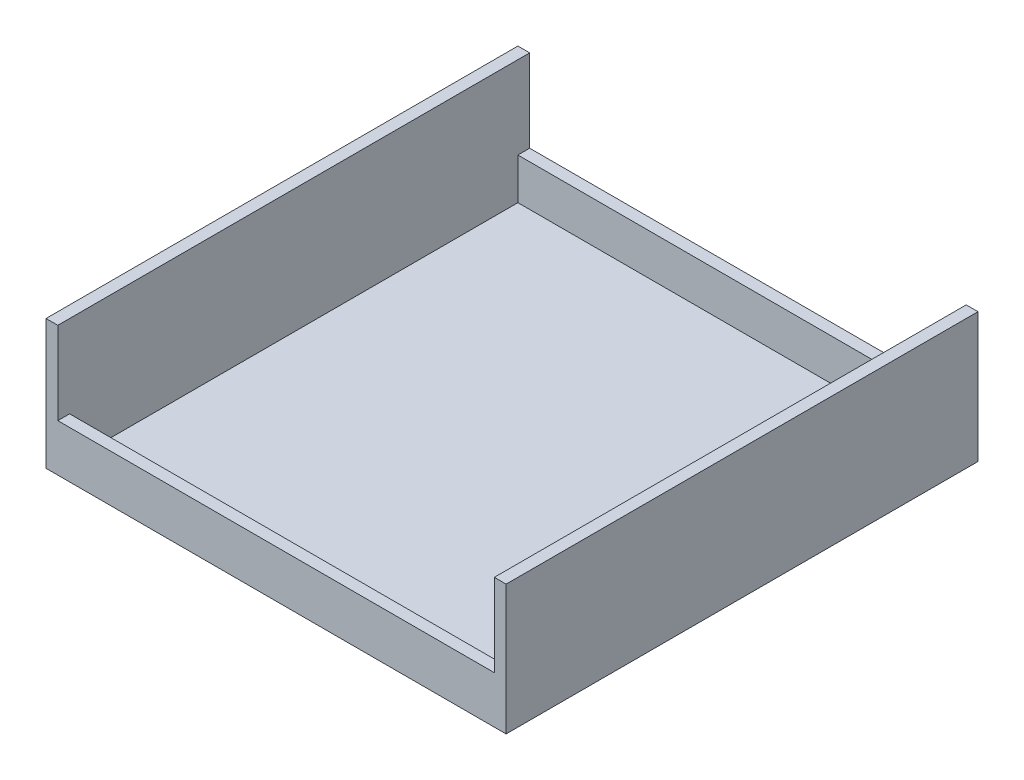
ISO-10303-21;
HEADER;
FILE_DESCRIPTION(('STEP AP214'),'2;1');
FILE_NAME('part.step','',(''),(''),'','','');
FILE_SCHEMA(('AUTOMOTIVE_DESIGN { 1 0 10303 214 1 1 1 1 }'));
ENDSEC;
DATA;
#1=APPLICATION_CONTEXT('core data for automotive mechanical design processes');
#2=APPLICATION_PROTOCOL_DEFINITION('international standard','automotive_design',2000,#1);
#3=PRODUCT_CONTEXT('',#1,'mechanical');
#4=PRODUCT('Part','Part','',(#3));
#5=PRODUCT_RELATED_PRODUCT_CATEGORY('part','',(#4));
#6=PRODUCT_DEFINITION_FORMATION('','',#4);
#7=PRODUCT_DEFINITION_CONTEXT('part definition',#1,'design');
#8=PRODUCT_DEFINITION('design','',#6,#7);
#9=PRODUCT_DEFINITION_SHAPE('','',#8);
#10=(LENGTH_UNIT() NAMED_UNIT(*) SI_UNIT(.MILLI.,.METRE.));
#11=(NAMED_UNIT(*) PLANE_ANGLE_UNIT() SI_UNIT($,.RADIAN.));
#12=(NAMED_UNIT(*) SI_UNIT($,.STERADIAN.) SOLID_ANGLE_UNIT());
#13=UNCERTAINTY_MEASURE_WITH_UNIT(LENGTH_MEASURE(1.E-05),#10,'distance_accuracy_value','');
#14=(GEOMETRIC_REPRESENTATION_CONTEXT(3) GLOBAL_UNCERTAINTY_ASSIGNED_CONTEXT((#13)) GLOBAL_UNIT_ASSIGNED_CONTEXT((#10,
#11,#12)) REPRESENTATION_CONTEXT('',''));
#15=CARTESIAN_POINT('',(0.,0.,0.));
#16=DIRECTION('',(0.,0.,1.));
#17=DIRECTION('',(1.,0.,0.));
#18=AXIS2_PLACEMENT_3D('',#15,#16,#17);
#19=CARTESIAN_POINT('',(0.,1.,0.));
#20=DIRECTION('',(0.,-1.,0.));
#21=DIRECTION('',(0.,0.,-1.));
#22=AXIS2_PLACEMENT_3D('',#19,#20,#21);
#23=PLANE('',#22);
#24=DIRECTION('',(1.,0.,0.));
#25=VECTOR('',#24,1.);
#26=CARTESIAN_POINT('',(76.,1.,-78.));
#27=LINE('',#26,#25);
#28=CARTESIAN_POINT('',(2.,1.,-78.));
#29=VERTEX_POINT('',#28);
#30=CARTESIAN_POINT('',(76.,1.,-78.));
#31=VERTEX_POINT('',#30);
#32=EDGE_CURVE('E61',#29,#31,#27,.T.);
#33=ORIENTED_EDGE('',*,*,#32,.F.);
#34=DIRECTION('',(0.,0.,-1.));
#35=VECTOR('',#34,1.);
#36=CARTESIAN_POINT('',(2.,1.,0.));
#37=LINE('',#36,#35);
#38=CARTESIAN_POINT('',(2.,1.,-2.));
#39=VERTEX_POINT('',#38);
#40=EDGE_CURVE('E39',#39,#29,#37,.T.);
#41=ORIENTED_EDGE('',*,*,#40,.F.);
#42=DIRECTION('',(-1.,0.,0.));
#43=VECTOR('',#42,1.);
#44=CARTESIAN_POINT('',(2.,1.,-2.));
#45=LINE('',#44,#43);
#46=CARTESIAN_POINT('',(76.,1.,-2.));
#47=VERTEX_POINT('',#46);
#48=EDGE_CURVE('E156',#47,#39,#45,.T.);
#49=ORIENTED_EDGE('',*,*,#48,.F.);
#50=DIRECTION('',(0.,0.,1.));
#51=VECTOR('',#50,1.);
#52=CARTESIAN_POINT('',(76.,1.,0.));
#53=LINE('',#52,#51);
#54=EDGE_CURVE('E134',#31,#47,#53,.T.);
#55=ORIENTED_EDGE('',*,*,#54,.F.);
#56=EDGE_LOOP('',(#33,#41,#49,#55));
#57=FACE_BOUND('',#56,.T.);
#58=ADVANCED_FACE('F35',(#57),#23,.F.);
#59=CARTESIAN_POINT('',(2.,22.,0.));
#60=DIRECTION('',(-1.,0.,0.));
#61=DIRECTION('',(0.,0.,1.));
#62=AXIS2_PLACEMENT_3D('',#59,#60,#61);
#63=PLANE('',#62);
#64=DIRECTION('',(0.,-1.,0.));
#65=VECTOR('',#64,1.);
#66=CARTESIAN_POINT('',(2.,8.,-78.));
#67=LINE('',#66,#65);
#68=CARTESIAN_POINT('',(2.,8.,-78.));
#69=VERTEX_POINT('',#68);
#70=EDGE_CURVE('E53',#69,#29,#67,.T.);
#71=ORIENTED_EDGE('',*,*,#70,.F.);
#72=DIRECTION('',(0.,0.,1.));
#73=VECTOR('',#72,1.);
#74=CARTESIAN_POINT('',(2.,8.,-80.));
#75=LINE('',#74,#73);
#76=CARTESIAN_POINT('',(2.,8.,-80.));
#77=VERTEX_POINT('',#76);
#78=EDGE_CURVE('E227',#77,#69,#75,.T.);
#79=ORIENTED_EDGE('',*,*,#78,.F.);
#80=DIRECTION('',(0.,-1.,0.));
#81=VECTOR('',#80,1.);
#82=CARTESIAN_POINT('',(2.,22.,-80.));
#83=LINE('',#82,#81);
#84=CARTESIAN_POINT('',(2.,22.,-80.));
#85=VERTEX_POINT('',#84);
#86=EDGE_CURVE('E183',#85,#77,#83,.T.);
#87=ORIENTED_EDGE('',*,*,#86,.F.);
#88=DIRECTION('',(0.,0.,-1.));
#89=VECTOR('',#88,1.);
#90=CARTESIAN_POINT('',(2.,22.,0.));
#91=LINE('',#90,#89);
#92=CARTESIAN_POINT('',(2.,22.,0.));
#93=VERTEX_POINT('',#92);
#94=EDGE_CURVE('E179',#93,#85,#91,.T.);
#95=ORIENTED_EDGE('',*,*,#94,.F.);
#96=DIRECTION('',(0.,-1.,0.));
#97=VECTOR('',#96,1.);
#98=CARTESIAN_POINT('',(2.,22.,0.));
#99=LINE('',#98,#97);
#100=CARTESIAN_POINT('',(2.,8.,0.));
#101=VERTEX_POINT('',#100);
#102=EDGE_CURVE('E190',#93,#101,#99,.T.);
#103=ORIENTED_EDGE('',*,*,#102,.T.);
#104=DIRECTION('',(0.,0.,1.));
#105=VECTOR('',#104,1.);
#106=CARTESIAN_POINT('',(2.,8.,0.));
#107=LINE('',#106,#105);
#108=CARTESIAN_POINT('',(2.,8.,-2.));
#109=VERTEX_POINT('',#108);
#110=EDGE_CURVE('E157',#109,#101,#107,.T.);
#111=ORIENTED_EDGE('',*,*,#110,.F.);
#112=DIRECTION('',(0.,-1.,0.));
#113=VECTOR('',#112,1.);
#114=CARTESIAN_POINT('',(2.,8.,-2.));
#115=LINE('',#114,#113);
#116=EDGE_CURVE('E139',#109,#39,#115,.T.);
#117=ORIENTED_EDGE('',*,*,#116,.T.);
#118=ORIENTED_EDGE('',*,*,#40,.T.);
#119=EDGE_LOOP('',(#71,#79,#87,#95,#103,#111,#117,#118));
#120=FACE_BOUND('',#119,.T.);
#121=ADVANCED_FACE('F211',(#120),#63,.F.);
#122=CARTESIAN_POINT('',(76.,22.,0.));
#123=DIRECTION('',(1.,0.,0.));
#124=DIRECTION('',(0.,0.,-1.));
#125=AXIS2_PLACEMENT_3D('',#122,#123,#124);
#126=PLANE('',#125);
#127=DIRECTION('',(0.,-1.,0.));
#128=VECTOR('',#127,1.);
#129=CARTESIAN_POINT('',(76.,8.,-78.));
#130=LINE('',#129,#128);
#131=CARTESIAN_POINT('',(76.,8.,-78.));
#132=VERTEX_POINT('',#131);
#133=EDGE_CURVE('E220',#132,#31,#130,.T.);
#134=ORIENTED_EDGE('',*,*,#133,.T.);
#135=ORIENTED_EDGE('',*,*,#54,.T.);
#136=DIRECTION('',(0.,-1.,0.));
#137=VECTOR('',#136,1.);
#138=CARTESIAN_POINT('',(76.,8.,-2.));
#139=LINE('',#138,#137);
#140=CARTESIAN_POINT('',(76.,8.,-2.));
#141=VERTEX_POINT('',#140);
#142=EDGE_CURVE('E128',#141,#47,#139,.T.);
#143=ORIENTED_EDGE('',*,*,#142,.F.);
#144=DIRECTION('',(0.,0.,-1.));
#145=VECTOR('',#144,1.);
#146=CARTESIAN_POINT('',(76.,8.,0.));
#147=LINE('',#146,#145);
#148=CARTESIAN_POINT('',(76.,8.,0.));
#149=VERTEX_POINT('',#148);
#150=EDGE_CURVE('E132',#149,#141,#147,.T.);
#151=ORIENTED_EDGE('',*,*,#150,.F.);
#152=DIRECTION('',(0.,-1.,0.));
#153=VECTOR('',#152,1.);
#154=CARTESIAN_POINT('',(76.,22.,0.));
#155=LINE('',#154,#153);
#156=CARTESIAN_POINT('',(76.,22.,0.));
#157=VERTEX_POINT('',#156);
#158=EDGE_CURVE('E169',#157,#149,#155,.T.);
#159=ORIENTED_EDGE('',*,*,#158,.F.);
#160=DIRECTION('',(0.,0.,1.));
#161=VECTOR('',#160,1.);
#162=CARTESIAN_POINT('',(76.,22.,0.));
#163=LINE('',#162,#161);
#164=CARTESIAN_POINT('',(76.,22.,-80.));
#165=VERTEX_POINT('',#164);
#166=EDGE_CURVE('E164',#165,#157,#163,.T.);
#167=ORIENTED_EDGE('',*,*,#166,.F.);
#168=DIRECTION('',(0.,-1.,0.));
#169=VECTOR('',#168,1.);
#170=CARTESIAN_POINT('',(76.,22.,-80.));
#171=LINE('',#170,#169);
#172=CARTESIAN_POINT('',(76.,8.,-80.));
#173=VERTEX_POINT('',#172);
#174=EDGE_CURVE('E172',#165,#173,#171,.T.);
#175=ORIENTED_EDGE('',*,*,#174,.T.);
#176=DIRECTION('',(0.,0.,-1.));
#177=VECTOR('',#176,1.);
#178=CARTESIAN_POINT('',(76.,8.,-80.));
#179=LINE('',#178,#177);
#180=EDGE_CURVE('E224',#132,#173,#179,.T.);
#181=ORIENTED_EDGE('',*,*,#180,.F.);
#182=EDGE_LOOP('',(#134,#135,#143,#151,#159,#167,#175,#181));
#183=FACE_BOUND('',#182,.T.);
#184=ADVANCED_FACE('F130',(#183),#126,.F.);
#185=CARTESIAN_POINT('',(0.,1.,0.));
#186=DIRECTION('',(1.,0.,0.));
#187=DIRECTION('',(0.,0.,-1.));
#188=AXIS2_PLACEMENT_3D('',#185,#186,#187);
#189=PLANE('',#188);
#190=DIRECTION('',(0.,0.,1.));
#191=VECTOR('',#190,1.);
#192=CARTESIAN_POINT('',(0.,0.,0.));
#193=LINE('',#192,#191);
#194=CARTESIAN_POINT('',(0.,0.,-80.));
#195=VERTEX_POINT('',#194);
#196=CARTESIAN_POINT('',(0.,0.,0.));
#197=VERTEX_POINT('',#196);
#198=EDGE_CURVE('E186',#195,#197,#193,.T.);
#199=ORIENTED_EDGE('',*,*,#198,.T.);
#200=DIRECTION('',(0.,-1.,0.));
#201=VECTOR('',#200,1.);
#202=CARTESIAN_POINT('',(0.,1.,0.));
#203=LINE('',#202,#201);
#204=CARTESIAN_POINT('',(0.,22.,0.));
#205=VERTEX_POINT('',#204);
#206=EDGE_CURVE('E11',#205,#197,#203,.T.);
#207=ORIENTED_EDGE('',*,*,#206,.F.);
#208=DIRECTION('',(0.,0.,1.));
#209=VECTOR('',#208,1.);
#210=CARTESIAN_POINT('',(0.,22.,0.));
#211=LINE('',#210,#209);
#212=CARTESIAN_POINT('',(0.,22.,-80.));
#213=VERTEX_POINT('',#212);
#214=EDGE_CURVE('E174',#213,#205,#211,.T.);
#215=ORIENTED_EDGE('',*,*,#214,.F.);
#216=DIRECTION('',(0.,-1.,0.));
#217=VECTOR('',#216,1.);
#218=CARTESIAN_POINT('',(0.,1.,-80.));
#219=LINE('',#218,#217);
#220=EDGE_CURVE('E196',#213,#195,#219,.T.);
#221=ORIENTED_EDGE('',*,*,#220,.T.);
#222=EDGE_LOOP('',(#199,#207,#215,#221));
#223=FACE_BOUND('',#222,.T.);
#224=ADVANCED_FACE('F37',(#223),#189,.F.);
#225=CARTESIAN_POINT('',(0.,1.,0.));
#226=DIRECTION('',(0.,0.,-1.));
#227=DIRECTION('',(-1.,0.,0.));
#228=AXIS2_PLACEMENT_3D('',#225,#226,#227);
#229=PLANE('',#228);
#230=DIRECTION('',(1.,0.,0.));
#231=VECTOR('',#230,1.);
#232=CARTESIAN_POINT('',(0.,0.,0.));
#233=LINE('',#232,#231);
#234=CARTESIAN_POINT('',(78.,0.,0.));
#235=VERTEX_POINT('',#234);
#236=EDGE_CURVE('E189',#197,#235,#233,.T.);
#237=ORIENTED_EDGE('',*,*,#236,.T.);
#238=DIRECTION('',(0.,-1.,0.));
#239=VECTOR('',#238,1.);
#240=CARTESIAN_POINT('',(78.,1.,0.));
#241=LINE('',#240,#239);
#242=CARTESIAN_POINT('',(78.,22.,0.));
#243=VERTEX_POINT('',#242);
#244=EDGE_CURVE('E45',#243,#235,#241,.T.);
#245=ORIENTED_EDGE('',*,*,#244,.F.);
#246=DIRECTION('',(1.,0.,0.));
#247=VECTOR('',#246,1.);
#248=CARTESIAN_POINT('',(78.,22.,0.));
#249=LINE('',#248,#247);
#250=EDGE_CURVE('E166',#157,#243,#249,.T.);
#251=ORIENTED_EDGE('',*,*,#250,.F.);
#252=ORIENTED_EDGE('',*,*,#158,.T.);
#253=DIRECTION('',(1.,0.,0.));
#254=VECTOR('',#253,1.);
#255=CARTESIAN_POINT('',(2.,8.,0.));
#256=LINE('',#255,#254);
#257=EDGE_CURVE('E149',#101,#149,#256,.T.);
#258=ORIENTED_EDGE('',*,*,#257,.F.);
#259=ORIENTED_EDGE('',*,*,#102,.F.);
#260=DIRECTION('',(1.,0.,0.));
#261=VECTOR('',#260,1.);
#262=CARTESIAN_POINT('',(0.,22.,0.));
#263=LINE('',#262,#261);
#264=EDGE_CURVE('E177',#205,#93,#263,.T.);
#265=ORIENTED_EDGE('',*,*,#264,.F.);
#266=ORIENTED_EDGE('',*,*,#206,.T.);
#267=EDGE_LOOP('',(#237,#245,#251,#252,#258,#259,#265,#266));
#268=FACE_BOUND('',#267,.T.);
#269=ADVANCED_FACE('F215',(#268),#229,.F.);
#270=CARTESIAN_POINT('',(78.,1.,0.));
#271=DIRECTION('',(-1.,0.,0.));
#272=DIRECTION('',(0.,0.,1.));
#273=AXIS2_PLACEMENT_3D('',#270,#271,#272);
#274=PLANE('',#273);
#275=DIRECTION('',(0.,0.,-1.));
#276=VECTOR('',#275,1.);
#277=CARTESIAN_POINT('',(78.,0.,0.));
#278=LINE('',#277,#276);
#279=CARTESIAN_POINT('',(78.,0.,-80.));
#280=VERTEX_POINT('',#279);
#281=EDGE_CURVE('E192',#235,#280,#278,.T.);
#282=ORIENTED_EDGE('',*,*,#281,.T.);
#283=DIRECTION('',(0.,-1.,0.));
#284=VECTOR('',#283,1.);
#285=CARTESIAN_POINT('',(78.,1.,-80.));
#286=LINE('',#285,#284);
#287=CARTESIAN_POINT('',(78.,22.,-80.));
#288=VERTEX_POINT('',#287);
#289=EDGE_CURVE('E199',#288,#280,#286,.T.);
#290=ORIENTED_EDGE('',*,*,#289,.F.);
#291=DIRECTION('',(0.,0.,-1.));
#292=VECTOR('',#291,1.);
#293=CARTESIAN_POINT('',(78.,22.,0.));
#294=LINE('',#293,#292);
#295=EDGE_CURVE('E159',#243,#288,#294,.T.);
#296=ORIENTED_EDGE('',*,*,#295,.F.);
#297=ORIENTED_EDGE('',*,*,#244,.T.);
#298=EDGE_LOOP('',(#282,#290,#296,#297));
#299=FACE_BOUND('',#298,.T.);
#300=ADVANCED_FACE('F269',(#299),#274,.F.);
#301=CARTESIAN_POINT('',(0.,1.,-80.));
#302=DIRECTION('',(0.,0.,1.));
#303=DIRECTION('',(1.,0.,0.));
#304=AXIS2_PLACEMENT_3D('',#301,#302,#303);
#305=PLANE('',#304);
#306=DIRECTION('',(-1.,0.,0.));
#307=VECTOR('',#306,1.);
#308=CARTESIAN_POINT('',(0.,0.,-80.));
#309=LINE('',#308,#307);
#310=EDGE_CURVE('E194',#280,#195,#309,.T.);
#311=ORIENTED_EDGE('',*,*,#310,.T.);
#312=ORIENTED_EDGE('',*,*,#220,.F.);
#313=DIRECTION('',(-1.,0.,0.));
#314=VECTOR('',#313,1.);
#315=CARTESIAN_POINT('',(0.,22.,-80.));
#316=LINE('',#315,#314);
#317=EDGE_CURVE('E181',#85,#213,#316,.T.);
#318=ORIENTED_EDGE('',*,*,#317,.F.);
#319=ORIENTED_EDGE('',*,*,#86,.T.);
#320=DIRECTION('',(-1.,0.,0.));
#321=VECTOR('',#320,1.);
#322=CARTESIAN_POINT('',(76.,8.,-80.));
#323=LINE('',#322,#321);
#324=EDGE_CURVE('E229',#173,#77,#323,.T.);
#325=ORIENTED_EDGE('',*,*,#324,.F.);
#326=ORIENTED_EDGE('',*,*,#174,.F.);
#327=DIRECTION('',(-1.,0.,0.));
#328=VECTOR('',#327,1.);
#329=CARTESIAN_POINT('',(78.,22.,-80.));
#330=LINE('',#329,#328);
#331=EDGE_CURVE('E162',#288,#165,#330,.T.);
#332=ORIENTED_EDGE('',*,*,#331,.F.);
#333=ORIENTED_EDGE('',*,*,#289,.T.);
#334=EDGE_LOOP('',(#311,#312,#318,#319,#325,#326,#332,#333));
#335=FACE_BOUND('',#334,.T.);
#336=ADVANCED_FACE('F242',(#335),#305,.F.);
#337=CARTESIAN_POINT('',(0.,0.,0.));
#338=DIRECTION('',(0.,-1.,0.));
#339=DIRECTION('',(0.,0.,-1.));
#340=AXIS2_PLACEMENT_3D('',#337,#338,#339);
#341=PLANE('',#340);
#342=ORIENTED_EDGE('',*,*,#198,.F.);
#343=ORIENTED_EDGE('',*,*,#310,.F.);
#344=ORIENTED_EDGE('',*,*,#281,.F.);
#345=ORIENTED_EDGE('',*,*,#236,.F.);
#346=EDGE_LOOP('',(#342,#343,#344,#345));
#347=FACE_BOUND('',#346,.T.);
#348=ADVANCED_FACE('F262',(#347),#341,.T.);
#349=CARTESIAN_POINT('',(0.,22.,0.));
#350=DIRECTION('',(0.,-1.,0.));
#351=DIRECTION('',(0.,0.,-1.));
#352=AXIS2_PLACEMENT_3D('',#349,#350,#351);
#353=PLANE('',#352);
#354=ORIENTED_EDGE('',*,*,#214,.T.);
#355=ORIENTED_EDGE('',*,*,#264,.T.);
#356=ORIENTED_EDGE('',*,*,#94,.T.);
#357=ORIENTED_EDGE('',*,*,#317,.T.);
#358=EDGE_LOOP('',(#354,#355,#356,#357));
#359=FACE_BOUND('',#358,.T.);
#360=ADVANCED_FACE('F265',(#359),#353,.F.);
#361=CARTESIAN_POINT('',(0.,22.,0.));
#362=DIRECTION('',(0.,1.,0.));
#363=DIRECTION('',(0.,0.,1.));
#364=AXIS2_PLACEMENT_3D('',#361,#362,#363);
#365=PLANE('',#364);
#366=ORIENTED_EDGE('',*,*,#295,.T.);
#367=ORIENTED_EDGE('',*,*,#331,.T.);
#368=ORIENTED_EDGE('',*,*,#166,.T.);
#369=ORIENTED_EDGE('',*,*,#250,.T.);
#370=EDGE_LOOP('',(#366,#367,#368,#369));
#371=FACE_BOUND('',#370,.T.);
#372=ADVANCED_FACE('F287',(#371),#365,.T.);
#373=CARTESIAN_POINT('',(2.,8.,-2.));
#374=DIRECTION('',(0.,0.,1.));
#375=DIRECTION('',(1.,0.,0.));
#376=AXIS2_PLACEMENT_3D('',#373,#374,#375);
#377=PLANE('',#376);
#378=ORIENTED_EDGE('',*,*,#48,.T.);
#379=ORIENTED_EDGE('',*,*,#116,.F.);
#380=DIRECTION('',(-1.,0.,0.));
#381=VECTOR('',#380,1.);
#382=CARTESIAN_POINT('',(2.,8.,-2.));
#383=LINE('',#382,#381);
#384=EDGE_CURVE('E146',#141,#109,#383,.T.);
#385=ORIENTED_EDGE('',*,*,#384,.F.);
#386=ORIENTED_EDGE('',*,*,#142,.T.);
#387=EDGE_LOOP('',(#378,#379,#385,#386));
#388=FACE_BOUND('',#387,.T.);
#389=ADVANCED_FACE('F151',(#388),#377,.F.);
#390=CARTESIAN_POINT('',(0.,8.,0.));
#391=DIRECTION('',(0.,-1.,0.));
#392=DIRECTION('',(0.,0.,-1.));
#393=AXIS2_PLACEMENT_3D('',#390,#391,#392);
#394=PLANE('',#393);
#395=ORIENTED_EDGE('',*,*,#110,.T.);
#396=ORIENTED_EDGE('',*,*,#257,.T.);
#397=ORIENTED_EDGE('',*,*,#150,.T.);
#398=ORIENTED_EDGE('',*,*,#384,.T.);
#399=EDGE_LOOP('',(#395,#396,#397,#398));
#400=FACE_BOUND('',#399,.T.);
#401=ADVANCED_FACE('F145',(#400),#394,.F.);
#402=CARTESIAN_POINT('',(76.,8.,-78.));
#403=DIRECTION('',(0.,0.,-1.));
#404=DIRECTION('',(-1.,0.,0.));
#405=AXIS2_PLACEMENT_3D('',#402,#403,#404);
#406=PLANE('',#405);
#407=ORIENTED_EDGE('',*,*,#32,.T.);
#408=ORIENTED_EDGE('',*,*,#133,.F.);
#409=DIRECTION('',(1.,0.,0.));
#410=VECTOR('',#409,1.);
#411=CARTESIAN_POINT('',(76.,8.,-78.));
#412=LINE('',#411,#410);
#413=EDGE_CURVE('E222',#69,#132,#412,.T.);
#414=ORIENTED_EDGE('',*,*,#413,.F.);
#415=ORIENTED_EDGE('',*,*,#70,.T.);
#416=EDGE_LOOP('',(#407,#408,#414,#415));
#417=FACE_BOUND('',#416,.T.);
#418=ADVANCED_FACE('F245',(#417),#406,.F.);
#419=CARTESIAN_POINT('',(0.,8.,0.));
#420=DIRECTION('',(0.,-1.,0.));
#421=DIRECTION('',(0.,0.,-1.));
#422=AXIS2_PLACEMENT_3D('',#419,#420,#421);
#423=PLANE('',#422);
#424=ORIENTED_EDGE('',*,*,#180,.T.);
#425=ORIENTED_EDGE('',*,*,#324,.T.);
#426=ORIENTED_EDGE('',*,*,#78,.T.);
#427=ORIENTED_EDGE('',*,*,#413,.T.);
#428=EDGE_LOOP('',(#424,#425,#426,#427));
#429=FACE_BOUND('',#428,.T.);
#430=ADVANCED_FACE('F234',(#429),#423,.F.);
#431=CLOSED_SHELL('',(#58,#121,#184,#224,#269,#300,#336,#348,#360,#372,#389,#401,#418,#430));
#432=MANIFOLD_SOLID_BREP('B2',#431);
#433=ADVANCED_BREP_SHAPE_REPRESENTATION('',(#18,#432),#14);
#434=SHAPE_DEFINITION_REPRESENTATION(#9,#433);
ENDSEC;
END-ISO-10303-21;
